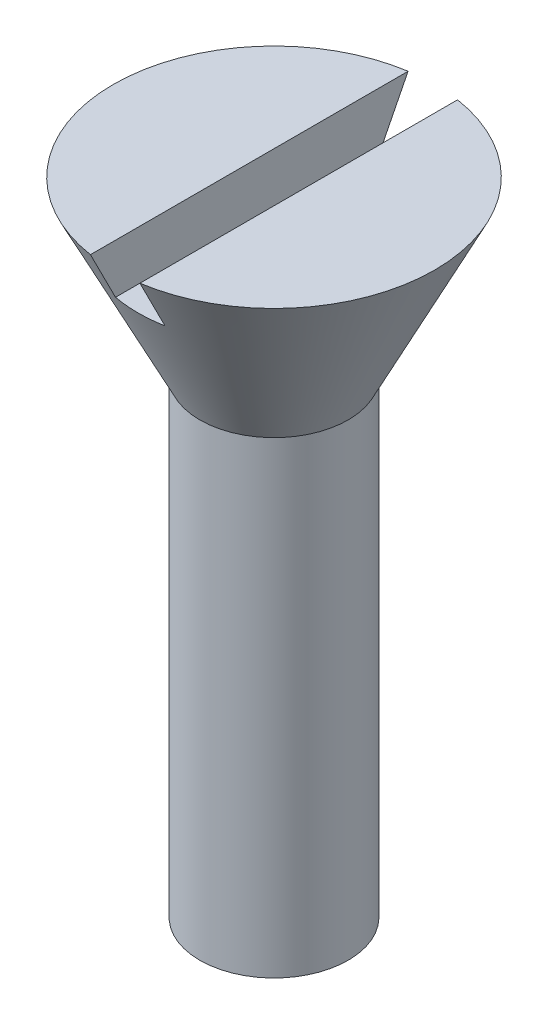
ISO-10303-21;
HEADER;
FILE_DESCRIPTION(('STEP AP214'),'2;1');
FILE_NAME('part.step','',(''),(''),'','','');
FILE_SCHEMA(('AUTOMOTIVE_DESIGN { 1 0 10303 214 1 1 1 1 }'));
ENDSEC;
DATA;
#1=APPLICATION_CONTEXT('core data for automotive mechanical design processes');
#2=APPLICATION_PROTOCOL_DEFINITION('international standard','automotive_design',2000,#1);
#3=PRODUCT_CONTEXT('',#1,'mechanical');
#4=PRODUCT('Part','Part','',(#3));
#5=PRODUCT_RELATED_PRODUCT_CATEGORY('part','',(#4));
#6=PRODUCT_DEFINITION_FORMATION('','',#4);
#7=PRODUCT_DEFINITION_CONTEXT('part definition',#1,'design');
#8=PRODUCT_DEFINITION('design','',#6,#7);
#9=PRODUCT_DEFINITION_SHAPE('','',#8);
#10=(LENGTH_UNIT() NAMED_UNIT(*) SI_UNIT(.MILLI.,.METRE.));
#11=(NAMED_UNIT(*) PLANE_ANGLE_UNIT() SI_UNIT($,.RADIAN.));
#12=(NAMED_UNIT(*) SI_UNIT($,.STERADIAN.) SOLID_ANGLE_UNIT());
#13=UNCERTAINTY_MEASURE_WITH_UNIT(LENGTH_MEASURE(1.E-05),#10,'distance_accuracy_value','');
#14=(GEOMETRIC_REPRESENTATION_CONTEXT(3) GLOBAL_UNCERTAINTY_ASSIGNED_CONTEXT((#13)) GLOBAL_UNIT_ASSIGNED_CONTEXT((#10,
#11,#12)) REPRESENTATION_CONTEXT('',''));
#15=CARTESIAN_POINT('',(0.,0.,0.));
#16=DIRECTION('',(0.,0.,1.));
#17=DIRECTION('',(1.,0.,0.));
#18=AXIS2_PLACEMENT_3D('',#15,#16,#17);
#19=CARTESIAN_POINT('',(-1.,7.,0.));
#20=DIRECTION('',(0.,1.,0.));
#21=DIRECTION('',(0.,0.,1.));
#22=AXIS2_PLACEMENT_3D('',#19,#20,#21);
#23=PLANE('',#22);
#24=DIRECTION('',(0.,0.,1.));
#25=VECTOR('',#24,1.);
#26=CARTESIAN_POINT('',(1.,7.,-6.5));
#27=LINE('',#26,#25);
#28=CARTESIAN_POINT('',(1.,7.,-6.42261628933256));
#29=VERTEX_POINT('',#28);
#30=CARTESIAN_POINT('',(1.,7.,6.42261628933256));
#31=VERTEX_POINT('',#30);
#32=EDGE_CURVE('E107',#29,#31,#27,.T.);
#33=ORIENTED_EDGE('',*,*,#32,.T.);
#34=CARTESIAN_POINT('',(0.,7.,0.));
#35=DIRECTION('',(0.,1.,0.));
#36=DIRECTION('',(0.,0.,1.));
#37=AXIS2_PLACEMENT_3D('',#34,#35,#36);
#38=CIRCLE('',#37,6.5);
#39=EDGE_CURVE('E11',#31,#29,#38,.T.);
#40=ORIENTED_EDGE('',*,*,#39,.T.);
#41=EDGE_LOOP('',(#33,#40));
#42=FACE_BOUND('',#41,.T.);
#43=ADVANCED_FACE('F40',(#42),#23,.T.);
#44=CARTESIAN_POINT('',(0.,7.,0.));
#45=DIRECTION('',(0.,1.,0.));
#46=DIRECTION('',(0.,0.,1.));
#47=AXIS2_PLACEMENT_3D('',#44,#45,#46);
#48=CONICAL_SURFACE('',#47,6.5,0.463647609000806);
#49=CARTESIAN_POINT('',(1.00000000000001,12.7201346411397,-9.30649559423954));
#50=CARTESIAN_POINT('',(1.00000000000001,12.1245113005983,-9.0069584387696));
#51=CARTESIAN_POINT('',(1.00000000000001,11.5289457077364,-8.70730623427084));
#52=CARTESIAN_POINT('',(1.00000000000001,10.3380013135926,-8.10764321963747));
#53=CARTESIAN_POINT('',(1.00000000000001,9.74262251079787,-7.80763241250711));
#54=CARTESIAN_POINT('',(1.00000000000001,8.55213823714182,-7.2071313949808));
#55=CARTESIAN_POINT('',(1.00000000000001,7.95703275579209,-6.90664120538171));
#56=CARTESIAN_POINT('',(1.,6.76717966507121,-6.30494016799408));
#57=CARTESIAN_POINT('',(1.,6.17243205877276,-6.00372931412544));
#58=CARTESIAN_POINT('',(1.,5.28071442895846,-5.55106281749499));
#59=CARTESIAN_POINT('',(1.,4.98353148521916,-5.40002665710199));
#60=CARTESIAN_POINT('',(0.999999999999999,4.38935004892015,-5.09759289535487));
#61=CARTESIAN_POINT('',(0.999999999999999,4.09235155609778,-4.94619529451694));
#62=CARTESIAN_POINT('',(0.999999999999998,3.49860159288638,-4.6429319505142));
#63=CARTESIAN_POINT('',(0.999999999999997,3.20185011736043,-4.49106621740994));
#64=CARTESIAN_POINT('',(0.999999999999996,2.60866982147997,-4.18670164785809));
#65=CARTESIAN_POINT('',(0.999999999999996,2.31224100283779,-4.03420280807111));
#66=CARTESIAN_POINT('',(0.999999999999995,1.71981389960009,-3.728315861723));
#67=CARTESIAN_POINT('',(0.999999999999994,1.42381564928914,-3.57492768872836));
#68=CARTESIAN_POINT('',(0.999999999999993,0.832479525812994,-3.26689137100303));
#69=CARTESIAN_POINT('',(0.999999999999993,0.537141643115863,-3.11224324461046));
#70=CARTESIAN_POINT('',(0.999999999999992,0.094891348382149,-2.87880858582827));
#71=CARTESIAN_POINT('',(0.999999999999992,-0.0524051969672117,-2.80075014077235));
#72=CARTESIAN_POINT('',(0.999999999999991,-0.346664492061562,-2.64400844162982));
#73=CARTESIAN_POINT('',(0.999999999999991,-0.493627243839408,-2.56532519136157));
#74=CARTESIAN_POINT('',(0.999999999999991,-0.787129269812412,-2.4071535900055));
#75=CARTESIAN_POINT('',(0.99999999999999,-0.933668522570516,-2.32766519904901));
#76=CARTESIAN_POINT('',(0.99999999999999,-1.22614828512362,-2.16758799960478));
#77=CARTESIAN_POINT('',(0.99999999999999,-1.37208878219818,-2.08699916789423));
#78=CARTESIAN_POINT('',(0.999999999999989,-1.51764283874328,-2.00571220025889));
#79=B_SPLINE_CURVE_WITH_KNOTS('',3,(#49,#50,#51,#52,#53,#54,#55,#56,#57,#58,#59,#60,#61,#62,#63,
#64,#65,#66,#67,#68,#69,#70,#71,#72,#73,#74,#75,#76,#77,#78),.UNSPECIFIED.,.F.,.F.,(4,2,2,2,2,2,
2,2,2,2,2,2,2,2,4),(0.,2.000101899677,4.00018715900159,6.0001878888336,8.00020555222735,
9.00028867643836,10.0003703732357,11.0004307252583,12.0004963589334,13.0006376859369,
14.0007644822043,14.5008678352488,15.0009681343734,15.5010933195389,16.0012290753073),.UNSPECIFIED.);
#80=CARTESIAN_POINT('',(1.,5.,-5.40832691319598));
#81=VERTEX_POINT('',#80);
#82=EDGE_CURVE('E105',#29,#81,#79,.T.);
#83=ORIENTED_EDGE('',*,*,#82,.F.);
#84=ORIENTED_EDGE('',*,*,#39,.F.);
#85=CARTESIAN_POINT('',(0.999999999999989,-1.51764283874328,2.00571220025889));
#86=CARTESIAN_POINT('',(0.99999999999999,-1.4049445745335,2.06866452953169));
#87=CARTESIAN_POINT('',(0.99999999999999,-1.29200716036111,2.13118586548321));
#88=CARTESIAN_POINT('',(0.99999999999999,-1.06574707768302,2.25552427249337));
#89=CARTESIAN_POINT('',(0.99999999999999,-0.952424414382041,2.31734135301782));
#90=CARTESIAN_POINT('',(0.999999999999991,-0.612022431114902,2.50197049382982));
#91=CARTESIAN_POINT('',(0.999999999999991,-0.384500287178441,2.62396535325138));
#92=CARTESIAN_POINT('',(0.999999999999992,0.0712916452473684,2.86650576165212));
#93=CARTESIAN_POINT('',(0.999999999999992,0.299561377924895,2.98705141581991));
#94=CARTESIAN_POINT('',(0.999999999999993,0.756635239369462,3.22713135689438));
#95=CARTESIAN_POINT('',(0.999999999999994,0.985439374734605,3.34666563122874));
#96=CARTESIAN_POINT('',(0.999999999999995,1.57687562387471,3.65445135040392));
#97=CARTESIAN_POINT('',(0.999999999999995,1.93979338416423,3.8421534972367));
#98=CARTESIAN_POINT('',(0.999999999999996,2.6662336500149,4.21638442632979));
#99=CARTESIAN_POINT('',(0.999999999999997,3.02975615719022,4.40291320545181));
#100=CARTESIAN_POINT('',(0.999999999999999,4.12096824621996,4.96134000684904));
#101=CARTESIAN_POINT('',(1.,4.84926170761692,5.33205744848106));
#102=CARTESIAN_POINT('',(1.,6.17248433382272,6.00374373420611));
#103=CARTESIAN_POINT('',(1.,6.76727533274932,6.30498536056835));
#104=CARTESIAN_POINT('',(1.,7.95722513388588,6.90674167635391));
#105=CARTESIAN_POINT('',(1.00000000000001,8.55238393614705,7.207256365676));
#106=CARTESIAN_POINT('',(1.00000000000001,9.74287439652637,7.80775843157455));
#107=CARTESIAN_POINT('',(1.00000000000001,10.3382060238859,8.10774586916161));
#108=CARTESIAN_POINT('',(1.00000000000001,11.5290505364811,8.70735944518234));
#109=CARTESIAN_POINT('',(1.00000000000001,12.1245634215511,9.00698558394476));
#110=CARTESIAN_POINT('',(1.00000000000001,12.7201346411397,9.30649559423954));
#111=B_SPLINE_CURVE_WITH_KNOTS('',3,(#85,#86,#87,#88,#89,#90,#91,#92,#93,#94,#95,#96,#97,#98,
#99,#100,#101,#102,#103,#104,#105,#106,#107,#108,#109,#110),.UNSPECIFIED.,.F.,.F.,(4,2,2,2,2,2,
2,2,2,2,2,2,4),(0.,0.387263129867398,0.77452104842603,1.54900659029122,2.32343557358128,
3.0978741695894,4.32362432658706,5.54937776059032,8.00102205168593,10.0011982373644,
12.0013747016024,14.0013020633189,16.0012276038781),.UNSPECIFIED.);
#112=CARTESIAN_POINT('',(1.,5.,5.40832691319598));
#113=VERTEX_POINT('',#112);
#114=EDGE_CURVE('E103',#113,#31,#111,.T.);
#115=ORIENTED_EDGE('',*,*,#114,.F.);
#116=CARTESIAN_POINT('',(0.,5.,0.));
#117=DIRECTION('',(0.,-1.,0.));
#118=DIRECTION('',(1.,0.,0.));
#119=AXIS2_PLACEMENT_3D('',#116,#117,#118);
#120=CIRCLE('',#119,5.5);
#121=CARTESIAN_POINT('',(-1.,5.,5.40832691319598));
#122=VERTEX_POINT('',#121);
#123=EDGE_CURVE('E59',#122,#113,#120,.F.);
#124=ORIENTED_EDGE('',*,*,#123,.F.);
#125=CARTESIAN_POINT('',(-0.999999999999999,12.7201346411397,9.30649559423954));
#126=CARTESIAN_POINT('',(-0.999999999999999,12.1245113005983,9.00695843876961));
#127=CARTESIAN_POINT('',(-0.999999999999999,11.5289457077364,8.70730623427085));
#128=CARTESIAN_POINT('',(-0.999999999999999,10.3380013135926,8.10764321963748));
#129=CARTESIAN_POINT('',(-1.,9.74262251079787,7.80763241250712));
#130=CARTESIAN_POINT('',(-1.,8.55213823714182,7.2071313949808));
#131=CARTESIAN_POINT('',(-1.,7.95703275579209,6.90664120538171));
#132=CARTESIAN_POINT('',(-1.,6.76717966507121,6.30494016799408));
#133=CARTESIAN_POINT('',(-1.,6.17243205877276,6.00372931412544));
#134=CARTESIAN_POINT('',(-1.,5.28071442895846,5.55106281749499));
#135=CARTESIAN_POINT('',(-1.,4.98353148521916,5.40002665710199));
#136=CARTESIAN_POINT('',(-1.,4.38935004892016,5.09759289535487));
#137=CARTESIAN_POINT('',(-1.,4.09235155609779,4.94619529451694));
#138=CARTESIAN_POINT('',(-1.,3.49860159288638,4.6429319505142));
#139=CARTESIAN_POINT('',(-1.,3.20185011736043,4.49106621740994));
#140=CARTESIAN_POINT('',(-1.,2.60866982147998,4.18670164785809));
#141=CARTESIAN_POINT('',(-1.,2.3122410028378,4.03420280807111));
#142=CARTESIAN_POINT('',(-1.,1.71981389960009,3.728315861723));
#143=CARTESIAN_POINT('',(-1.,1.42381564928915,3.57492768872836));
#144=CARTESIAN_POINT('',(-1.,0.832479525812997,3.26689137100303));
#145=CARTESIAN_POINT('',(-1.,0.537141643115866,3.11224324461046));
#146=CARTESIAN_POINT('',(-1.,0.0948913483821532,2.87880858582827));
#147=CARTESIAN_POINT('',(-1.,-0.0524051969672073,2.80075014077234));
#148=CARTESIAN_POINT('',(-1.,-0.346664492061558,2.64400844162982));
#149=CARTESIAN_POINT('',(-1.,-0.493627243839404,2.56532519136157));
#150=CARTESIAN_POINT('',(-1.,-0.787129269812408,2.4071535900055));
#151=CARTESIAN_POINT('',(-1.,-0.933668522570513,2.327665199049));
#152=CARTESIAN_POINT('',(-1.,-1.22614828512362,2.16758799960478));
#153=CARTESIAN_POINT('',(-1.,-1.37208878219818,2.08699916789422));
#154=CARTESIAN_POINT('',(-1.,-1.51764283874328,2.00571220025889));
#155=B_SPLINE_CURVE_WITH_KNOTS('',3,(#125,#126,#127,#128,#129,#130,#131,#132,#133,#134,#135,
#136,#137,#138,#139,#140,#141,#142,#143,#144,#145,#146,#147,#148,#149,#150,#151,#152,#153,#154),
.UNSPECIFIED.,.F.,.F.,(4,2,2,2,2,2,2,2,2,2,2,2,2,2,4),(0.,2.000101899677,4.00018715900159,
6.0001878888336,8.00020555222735,9.00028867643836,10.0003703732357,11.0004307252583,
12.0004963589334,13.0006376859369,14.0007644822043,14.5008678352488,15.0009681343734,
15.5010933195389,16.0012290753073),.UNSPECIFIED.);
#156=CARTESIAN_POINT('',(-1.,7.,6.42261628933256));
#157=VERTEX_POINT('',#156);
#158=EDGE_CURVE('E98',#157,#122,#155,.T.);
#159=ORIENTED_EDGE('',*,*,#158,.F.);
#160=CARTESIAN_POINT('',(-1.,7.,-6.42261628933256));
#161=VERTEX_POINT('',#160);
#162=EDGE_CURVE('E45',#161,#157,#38,.T.);
#163=ORIENTED_EDGE('',*,*,#162,.F.);
#164=CARTESIAN_POINT('',(-1.,-1.51764283874328,-2.00571220025889));
#165=CARTESIAN_POINT('',(-1.,-1.4049445745335,-2.06866452953169));
#166=CARTESIAN_POINT('',(-1.,-1.29200716036111,-2.1311858654832));
#167=CARTESIAN_POINT('',(-1.,-1.06574707768302,-2.25552427249336));
#168=CARTESIAN_POINT('',(-1.,-0.952424414382038,-2.31734135301781));
#169=CARTESIAN_POINT('',(-1.,-0.612022431114899,-2.50197049382981));
#170=CARTESIAN_POINT('',(-1.,-0.384500287178439,-2.62396535325138));
#171=CARTESIAN_POINT('',(-1.,0.0712916452473713,-2.86650576165212));
#172=CARTESIAN_POINT('',(-1.,0.299561377924898,-2.9870514158199));
#173=CARTESIAN_POINT('',(-1.,0.756635239369465,-3.22713135689438));
#174=CARTESIAN_POINT('',(-1.,0.985439374734608,-3.34666563122874));
#175=CARTESIAN_POINT('',(-1.,1.57687562387471,-3.65445135040392));
#176=CARTESIAN_POINT('',(-1.,1.93979338416423,-3.8421534972367));
#177=CARTESIAN_POINT('',(-1.,2.6662336500149,-4.21638442632979));
#178=CARTESIAN_POINT('',(-1.,3.02975615719023,-4.40291320545181));
#179=CARTESIAN_POINT('',(-1.,4.12096824621996,-4.96134000684904));
#180=CARTESIAN_POINT('',(-1.,4.84926170761692,-5.33205744848106));
#181=CARTESIAN_POINT('',(-1.,6.17248433382272,-6.00374373420611));
#182=CARTESIAN_POINT('',(-1.,6.76727533274932,-6.30498536056835));
#183=CARTESIAN_POINT('',(-1.,7.95722513388588,-6.90674167635391));
#184=CARTESIAN_POINT('',(-1.,8.55238393614705,-7.207256365676));
#185=CARTESIAN_POINT('',(-1.,9.74287439652637,-7.80775843157455));
#186=CARTESIAN_POINT('',(-0.999999999999999,10.3382060238859,-8.10774586916162));
#187=CARTESIAN_POINT('',(-0.999999999999999,11.5290505364811,-8.70735944518235));
#188=CARTESIAN_POINT('',(-0.999999999999999,12.1245634215511,-9.00698558394477));
#189=CARTESIAN_POINT('',(-0.999999999999999,12.7201346411397,-9.30649559423954));
#190=B_SPLINE_CURVE_WITH_KNOTS('',3,(#164,#165,#166,#167,#168,#169,#170,#171,#172,#173,#174,
#175,#176,#177,#178,#179,#180,#181,#182,#183,#184,#185,#186,#187,#188,#189),.UNSPECIFIED.,.F.,
.F.,(4,2,2,2,2,2,2,2,2,2,2,2,4),(0.,0.387263129867397,0.77452104842603,1.54900659029122,
2.32343557358128,3.0978741695894,4.32362432658707,5.54937776059033,8.00102205168593,
10.0011982373644,12.0013747016024,14.0013020633189,16.0012276038781),.UNSPECIFIED.);
#191=CARTESIAN_POINT('',(-1.,5.,-5.40832691319598));
#192=VERTEX_POINT('',#191);
#193=EDGE_CURVE('E95',#192,#161,#190,.T.);
#194=ORIENTED_EDGE('',*,*,#193,.F.);
#195=EDGE_CURVE('E80',#81,#192,#120,.F.);
#196=ORIENTED_EDGE('',*,*,#195,.F.);
#197=EDGE_LOOP('',(#83,#84,#115,#124,#159,#163,#194,#196));
#198=FACE_BOUND('',#197,.T.);
#199=CARTESIAN_POINT('',(0.,0.,0.));
#200=DIRECTION('',(0.,1.,0.));
#201=DIRECTION('',(0.,0.,1.));
#202=AXIS2_PLACEMENT_3D('',#199,#200,#201);
#203=CIRCLE('',#202,3.);
#204=CARTESIAN_POINT('',(0.,0.,3.));
#205=VERTEX_POINT('',#204);
#206=EDGE_CURVE('E156',#205,#205,#203,.T.);
#207=ORIENTED_EDGE('',*,*,#206,.T.);
#208=EDGE_LOOP('',(#207));
#209=FACE_BOUND('',#208,.T.);
#210=ADVANCED_FACE('F42',(#198,#209),#48,.T.);
#211=DIRECTION('',(0.,0.,1.));
#212=VECTOR('',#211,1.);
#213=CARTESIAN_POINT('',(-1.,7.,-6.5));
#214=LINE('',#213,#212);
#215=EDGE_CURVE('E99',#161,#157,#214,.T.);
#216=ORIENTED_EDGE('',*,*,#215,.F.);
#217=ORIENTED_EDGE('',*,*,#162,.T.);
#218=EDGE_LOOP('',(#216,#217));
#219=FACE_BOUND('',#218,.T.);
#220=ADVANCED_FACE('F134',(#219),#23,.T.);
#221=CARTESIAN_POINT('',(0.,5.,0.));
#222=DIRECTION('',(0.,1.,0.));
#223=DIRECTION('',(0.,0.,1.));
#224=AXIS2_PLACEMENT_3D('',#221,#222,#223);
#225=CYLINDRICAL_SURFACE('',#224,3.);
#226=CARTESIAN_POINT('',(0.,-18.9241490316192,0.));
#227=DIRECTION('',(0.,1.,0.));
#228=DIRECTION('',(0.,0.,1.));
#229=AXIS2_PLACEMENT_3D('',#226,#227,#228);
#230=CIRCLE('',#229,3.);
#231=CARTESIAN_POINT('',(0.,-18.9241490316192,3.));
#232=VERTEX_POINT('',#231);
#233=EDGE_CURVE('E90',#232,#232,#230,.T.);
#234=ORIENTED_EDGE('',*,*,#233,.T.);
#235=EDGE_LOOP('',(#234));
#236=FACE_BOUND('',#235,.T.);
#237=ORIENTED_EDGE('',*,*,#206,.F.);
#238=EDGE_LOOP('',(#237));
#239=FACE_BOUND('',#238,.T.);
#240=ADVANCED_FACE('F131',(#236,#239),#225,.T.);
#241=CARTESIAN_POINT('',(0.,-18.9241490316192,0.));
#242=DIRECTION('',(0.,1.,0.));
#243=DIRECTION('',(0.,0.,1.));
#244=AXIS2_PLACEMENT_3D('',#241,#242,#243);
#245=CONICAL_SURFACE('',#244,3.,1.0471975511966);
#246=CARTESIAN_POINT('',(0.,-20.6561998391881,0.));
#247=VERTEX_POINT('',#246);
#248=VERTEX_LOOP('',#247);
#249=FACE_BOUND('',#248,.T.);
#250=ORIENTED_EDGE('',*,*,#233,.F.);
#251=EDGE_LOOP('',(#250));
#252=FACE_BOUND('',#251,.T.);
#253=ADVANCED_FACE('F127',(#249,#252),#245,.T.);
#254=CARTESIAN_POINT('',(1.,7.,-6.5));
#255=DIRECTION('',(1.,0.,0.));
#256=DIRECTION('',(0.,1.,0.));
#257=AXIS2_PLACEMENT_3D('',#254,#255,#256);
#258=PLANE('',#257);
#259=ORIENTED_EDGE('',*,*,#114,.T.);
#260=ORIENTED_EDGE('',*,*,#32,.F.);
#261=ORIENTED_EDGE('',*,*,#82,.T.);
#262=DIRECTION('',(0.,0.,1.));
#263=VECTOR('',#262,1.);
#264=CARTESIAN_POINT('',(1.,5.,-6.5));
#265=LINE('',#264,#263);
#266=EDGE_CURVE('E85',#81,#113,#265,.T.);
#267=ORIENTED_EDGE('',*,*,#266,.T.);
#268=EDGE_LOOP('',(#259,#260,#261,#267));
#269=FACE_BOUND('',#268,.T.);
#270=ADVANCED_FACE('F125',(#269),#258,.F.);
#271=CARTESIAN_POINT('',(-1.,7.,-6.5));
#272=DIRECTION('',(-1.,0.,0.));
#273=DIRECTION('',(0.,-1.,0.));
#274=AXIS2_PLACEMENT_3D('',#271,#272,#273);
#275=PLANE('',#274);
#276=ORIENTED_EDGE('',*,*,#193,.T.);
#277=ORIENTED_EDGE('',*,*,#215,.T.);
#278=ORIENTED_EDGE('',*,*,#158,.T.);
#279=DIRECTION('',(0.,0.,1.));
#280=VECTOR('',#279,1.);
#281=CARTESIAN_POINT('',(-1.,5.,-6.5));
#282=LINE('',#281,#280);
#283=EDGE_CURVE('E83',#192,#122,#282,.T.);
#284=ORIENTED_EDGE('',*,*,#283,.F.);
#285=EDGE_LOOP('',(#276,#277,#278,#284));
#286=FACE_BOUND('',#285,.T.);
#287=ADVANCED_FACE('F94',(#286),#275,.F.);
#288=CARTESIAN_POINT('',(0.,5.,0.));
#289=DIRECTION('',(0.,1.,0.));
#290=DIRECTION('',(0.,0.,1.));
#291=AXIS2_PLACEMENT_3D('',#288,#289,#290);
#292=PLANE('',#291);
#293=ORIENTED_EDGE('',*,*,#283,.T.);
#294=ORIENTED_EDGE('',*,*,#123,.T.);
#295=ORIENTED_EDGE('',*,*,#266,.F.);
#296=ORIENTED_EDGE('',*,*,#195,.T.);
#297=EDGE_LOOP('',(#293,#294,#295,#296));
#298=FACE_BOUND('',#297,.T.);
#299=ADVANCED_FACE('F82',(#298),#292,.T.);
#300=CLOSED_SHELL('',(#43,#210,#220,#240,#253,#270,#287,#299));
#301=MANIFOLD_SOLID_BREP('B2',#300);
#302=ADVANCED_BREP_SHAPE_REPRESENTATION('',(#18,#301),#14);
#303=SHAPE_DEFINITION_REPRESENTATION(#9,#302);
ENDSEC;
END-ISO-10303-21;
